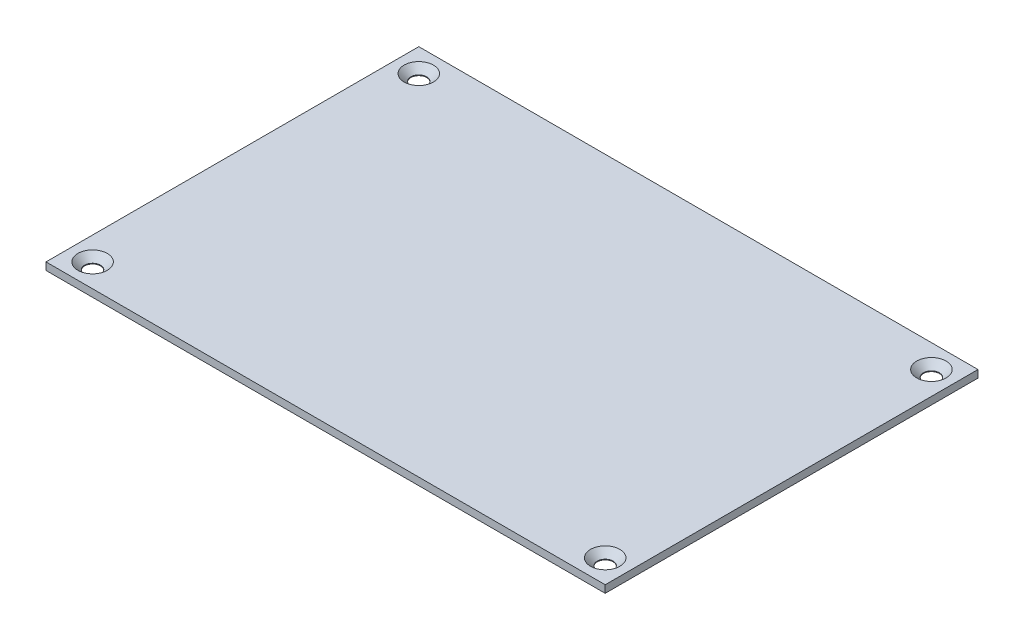
ISO-10303-21;
HEADER;
FILE_DESCRIPTION(('STEP AP214'),'2;1');
FILE_NAME('part.step','',(''),(''),'','','');
FILE_SCHEMA(('AUTOMOTIVE_DESIGN { 1 0 10303 214 1 1 1 1 }'));
ENDSEC;
DATA;
#1=APPLICATION_CONTEXT('core data for automotive mechanical design processes');
#2=APPLICATION_PROTOCOL_DEFINITION('international standard','automotive_design',2000,#1);
#3=PRODUCT_CONTEXT('',#1,'mechanical');
#4=PRODUCT('Part','Part','',(#3));
#5=PRODUCT_RELATED_PRODUCT_CATEGORY('part','',(#4));
#6=PRODUCT_DEFINITION_FORMATION('','',#4);
#7=PRODUCT_DEFINITION_CONTEXT('part definition',#1,'design');
#8=PRODUCT_DEFINITION('design','',#6,#7);
#9=PRODUCT_DEFINITION_SHAPE('','',#8);
#10=(LENGTH_UNIT() NAMED_UNIT(*) SI_UNIT(.MILLI.,.METRE.));
#11=(NAMED_UNIT(*) PLANE_ANGLE_UNIT() SI_UNIT($,.RADIAN.));
#12=(NAMED_UNIT(*) SI_UNIT($,.STERADIAN.) SOLID_ANGLE_UNIT());
#13=UNCERTAINTY_MEASURE_WITH_UNIT(LENGTH_MEASURE(1.E-05),#10,'distance_accuracy_value','');
#14=(GEOMETRIC_REPRESENTATION_CONTEXT(3) GLOBAL_UNCERTAINTY_ASSIGNED_CONTEXT((#13)) GLOBAL_UNIT_ASSIGNED_CONTEXT((#10,
#11,#12)) REPRESENTATION_CONTEXT('',''));
#15=CARTESIAN_POINT('',(0.,0.,0.));
#16=DIRECTION('',(0.,0.,1.));
#17=DIRECTION('',(1.,0.,0.));
#18=AXIS2_PLACEMENT_3D('',#15,#16,#17);
#19=CARTESIAN_POINT('',(0.,1.6,0.));
#20=DIRECTION('',(1.,0.,0.));
#21=DIRECTION('',(0.,0.,-1.));
#22=AXIS2_PLACEMENT_3D('',#19,#20,#21);
#23=PLANE('',#22);
#24=DIRECTION('',(0.,0.,1.));
#25=VECTOR('',#24,1.);
#26=CARTESIAN_POINT('',(0.,0.,0.));
#27=LINE('',#26,#25);
#28=CARTESIAN_POINT('',(0.,0.,-80.0000000000001));
#29=VERTEX_POINT('',#28);
#30=CARTESIAN_POINT('',(0.,0.,0.));
#31=VERTEX_POINT('',#30);
#32=EDGE_CURVE('E116',#29,#31,#27,.T.);
#33=ORIENTED_EDGE('',*,*,#32,.T.);
#34=DIRECTION('',(0.,-1.,0.));
#35=VECTOR('',#34,1.);
#36=CARTESIAN_POINT('',(0.,1.6,0.));
#37=LINE('',#36,#35);
#38=CARTESIAN_POINT('',(0.,1.6,0.));
#39=VERTEX_POINT('',#38);
#40=EDGE_CURVE('E11',#39,#31,#37,.T.);
#41=ORIENTED_EDGE('',*,*,#40,.F.);
#42=DIRECTION('',(0.,0.,1.));
#43=VECTOR('',#42,1.);
#44=CARTESIAN_POINT('',(0.,1.6,0.));
#45=LINE('',#44,#43);
#46=CARTESIAN_POINT('',(0.,1.6,-80.0000000000001));
#47=VERTEX_POINT('',#46);
#48=EDGE_CURVE('E99',#47,#39,#45,.T.);
#49=ORIENTED_EDGE('',*,*,#48,.F.);
#50=DIRECTION('',(0.,-1.,0.));
#51=VECTOR('',#50,1.);
#52=CARTESIAN_POINT('',(0.,1.6,-80.0000000000001));
#53=LINE('',#52,#51);
#54=EDGE_CURVE('E112',#47,#29,#53,.T.);
#55=ORIENTED_EDGE('',*,*,#54,.T.);
#56=EDGE_LOOP('',(#33,#41,#49,#55));
#57=FACE_BOUND('',#56,.T.);
#58=ADVANCED_FACE('F45',(#57),#23,.F.);
#59=CARTESIAN_POINT('',(0.,1.6,0.));
#60=DIRECTION('',(0.,0.,-1.));
#61=DIRECTION('',(-1.,0.,0.));
#62=AXIS2_PLACEMENT_3D('',#59,#60,#61);
#63=PLANE('',#62);
#64=DIRECTION('',(1.,0.,0.));
#65=VECTOR('',#64,1.);
#66=CARTESIAN_POINT('',(0.,0.,0.));
#67=LINE('',#66,#65);
#68=CARTESIAN_POINT('',(120.,0.,0.));
#69=VERTEX_POINT('',#68);
#70=EDGE_CURVE('E104',#31,#69,#67,.T.);
#71=ORIENTED_EDGE('',*,*,#70,.T.);
#72=DIRECTION('',(0.,-1.,0.));
#73=VECTOR('',#72,1.);
#74=CARTESIAN_POINT('',(120.,1.6,0.));
#75=LINE('',#74,#73);
#76=CARTESIAN_POINT('',(120.,1.6,0.));
#77=VERTEX_POINT('',#76);
#78=EDGE_CURVE('E55',#77,#69,#75,.T.);
#79=ORIENTED_EDGE('',*,*,#78,.F.);
#80=DIRECTION('',(1.,0.,0.));
#81=VECTOR('',#80,1.);
#82=CARTESIAN_POINT('',(0.,1.6,0.));
#83=LINE('',#82,#81);
#84=EDGE_CURVE('E94',#39,#77,#83,.T.);
#85=ORIENTED_EDGE('',*,*,#84,.F.);
#86=ORIENTED_EDGE('',*,*,#40,.T.);
#87=EDGE_LOOP('',(#71,#79,#85,#86));
#88=FACE_BOUND('',#87,.T.);
#89=ADVANCED_FACE('F103',(#88),#63,.F.);
#90=CARTESIAN_POINT('',(120.,1.6,0.));
#91=DIRECTION('',(-1.,0.,0.));
#92=DIRECTION('',(0.,0.,1.));
#93=AXIS2_PLACEMENT_3D('',#90,#91,#92);
#94=PLANE('',#93);
#95=DIRECTION('',(0.,0.,-1.));
#96=VECTOR('',#95,1.);
#97=CARTESIAN_POINT('',(120.,0.,0.));
#98=LINE('',#97,#96);
#99=CARTESIAN_POINT('',(120.,0.,-80.0000000000001));
#100=VERTEX_POINT('',#99);
#101=EDGE_CURVE('E81',#69,#100,#98,.T.);
#102=ORIENTED_EDGE('',*,*,#101,.T.);
#103=DIRECTION('',(0.,-1.,0.));
#104=VECTOR('',#103,1.);
#105=CARTESIAN_POINT('',(120.,1.6,-80.0000000000001));
#106=LINE('',#105,#104);
#107=CARTESIAN_POINT('',(120.,1.6,-80.0000000000001));
#108=VERTEX_POINT('',#107);
#109=EDGE_CURVE('E106',#108,#100,#106,.T.);
#110=ORIENTED_EDGE('',*,*,#109,.F.);
#111=DIRECTION('',(0.,0.,-1.));
#112=VECTOR('',#111,1.);
#113=CARTESIAN_POINT('',(120.,1.6,0.));
#114=LINE('',#113,#112);
#115=EDGE_CURVE('E97',#77,#108,#114,.T.);
#116=ORIENTED_EDGE('',*,*,#115,.F.);
#117=ORIENTED_EDGE('',*,*,#78,.T.);
#118=EDGE_LOOP('',(#102,#110,#116,#117));
#119=FACE_BOUND('',#118,.T.);
#120=ADVANCED_FACE('F108',(#119),#94,.F.);
#121=CARTESIAN_POINT('',(0.,1.6,-80.0000000000001));
#122=DIRECTION('',(0.,0.,1.));
#123=DIRECTION('',(1.,0.,0.));
#124=AXIS2_PLACEMENT_3D('',#121,#122,#123);
#125=PLANE('',#124);
#126=DIRECTION('',(-1.,0.,0.));
#127=VECTOR('',#126,1.);
#128=CARTESIAN_POINT('',(0.,0.,-80.0000000000001));
#129=LINE('',#128,#127);
#130=EDGE_CURVE('E87',#100,#29,#129,.T.);
#131=ORIENTED_EDGE('',*,*,#130,.T.);
#132=ORIENTED_EDGE('',*,*,#54,.F.);
#133=DIRECTION('',(-1.,0.,0.));
#134=VECTOR('',#133,1.);
#135=CARTESIAN_POINT('',(0.,1.6,-80.0000000000001));
#136=LINE('',#135,#134);
#137=EDGE_CURVE('E64',#108,#47,#136,.T.);
#138=ORIENTED_EDGE('',*,*,#137,.F.);
#139=ORIENTED_EDGE('',*,*,#109,.T.);
#140=EDGE_LOOP('',(#131,#132,#138,#139));
#141=FACE_BOUND('',#140,.T.);
#142=ADVANCED_FACE('F183',(#141),#125,.F.);
#143=CARTESIAN_POINT('',(0.,1.6,0.));
#144=DIRECTION('',(0.,-1.,0.));
#145=DIRECTION('',(0.,0.,-1.));
#146=AXIS2_PLACEMENT_3D('',#143,#144,#145);
#147=PLANE('',#146);
#148=CARTESIAN_POINT('',(5.,1.6,-75.0000000000001));
#149=DIRECTION('',(0.,1.,0.));
#150=DIRECTION('',(0.,0.,1.));
#151=AXIS2_PLACEMENT_3D('',#148,#149,#150);
#152=CIRCLE('',#151,3.15);
#153=CARTESIAN_POINT('',(5.,1.6,-71.8500000000001));
#154=VERTEX_POINT('',#153);
#155=EDGE_CURVE('E305',#154,#154,#152,.T.);
#156=ORIENTED_EDGE('',*,*,#155,.F.);
#157=EDGE_LOOP('',(#156));
#158=FACE_BOUND('',#157,.T.);
#159=CARTESIAN_POINT('',(5.,1.6,-5.));
#160=DIRECTION('',(0.,1.,0.));
#161=DIRECTION('',(0.,0.,1.));
#162=AXIS2_PLACEMENT_3D('',#159,#160,#161);
#163=CIRCLE('',#162,3.15);
#164=CARTESIAN_POINT('',(5.,1.6,-1.85));
#165=VERTEX_POINT('',#164);
#166=EDGE_CURVE('E152',#165,#165,#163,.T.);
#167=ORIENTED_EDGE('',*,*,#166,.F.);
#168=EDGE_LOOP('',(#167));
#169=FACE_BOUND('',#168,.T.);
#170=CARTESIAN_POINT('',(115.,1.6,-5.));
#171=DIRECTION('',(0.,1.,0.));
#172=DIRECTION('',(0.,0.,1.));
#173=AXIS2_PLACEMENT_3D('',#170,#171,#172);
#174=CIRCLE('',#173,3.15);
#175=CARTESIAN_POINT('',(115.,1.6,-1.85));
#176=VERTEX_POINT('',#175);
#177=EDGE_CURVE('E143',#176,#176,#174,.T.);
#178=ORIENTED_EDGE('',*,*,#177,.F.);
#179=EDGE_LOOP('',(#178));
#180=FACE_BOUND('',#179,.T.);
#181=CARTESIAN_POINT('',(115.,1.6,-75.0000000000001));
#182=DIRECTION('',(0.,1.,0.));
#183=DIRECTION('',(0.,0.,1.));
#184=AXIS2_PLACEMENT_3D('',#181,#182,#183);
#185=CIRCLE('',#184,3.15);
#186=CARTESIAN_POINT('',(115.,1.6,-71.8500000000001));
#187=VERTEX_POINT('',#186);
#188=EDGE_CURVE('E138',#187,#187,#185,.T.);
#189=ORIENTED_EDGE('',*,*,#188,.F.);
#190=EDGE_LOOP('',(#189));
#191=FACE_BOUND('',#190,.T.);
#192=ORIENTED_EDGE('',*,*,#48,.T.);
#193=ORIENTED_EDGE('',*,*,#84,.T.);
#194=ORIENTED_EDGE('',*,*,#115,.T.);
#195=ORIENTED_EDGE('',*,*,#137,.T.);
#196=EDGE_LOOP('',(#192,#193,#194,#195));
#197=FACE_BOUND('',#196,.T.);
#198=ADVANCED_FACE('F95',(#158,#169,#180,#191,#197),#147,.F.);
#199=CARTESIAN_POINT('',(0.,0.,0.));
#200=DIRECTION('',(0.,-1.,0.));
#201=DIRECTION('',(0.,0.,-1.));
#202=AXIS2_PLACEMENT_3D('',#199,#200,#201);
#203=PLANE('',#202);
#204=CARTESIAN_POINT('',(5.,0.,-75.0000000000001));
#205=DIRECTION('',(0.,-1.,0.));
#206=DIRECTION('',(0.,0.,-1.));
#207=AXIS2_PLACEMENT_3D('',#204,#205,#206);
#208=CIRCLE('',#207,1.69999999999999);
#209=CARTESIAN_POINT('',(5.,0.,-76.7000000000001));
#210=VERTEX_POINT('',#209);
#211=EDGE_CURVE('E48',#210,#210,#208,.T.);
#212=ORIENTED_EDGE('',*,*,#211,.F.);
#213=EDGE_LOOP('',(#212));
#214=FACE_BOUND('',#213,.T.);
#215=CARTESIAN_POINT('',(5.,0.,-5.));
#216=DIRECTION('',(0.,-1.,0.));
#217=DIRECTION('',(0.,0.,-1.));
#218=AXIS2_PLACEMENT_3D('',#215,#216,#217);
#219=CIRCLE('',#218,1.69999999999999);
#220=CARTESIAN_POINT('',(5.,0.,-6.69999999999999));
#221=VERTEX_POINT('',#220);
#222=EDGE_CURVE('E140',#221,#221,#219,.T.);
#223=ORIENTED_EDGE('',*,*,#222,.F.);
#224=EDGE_LOOP('',(#223));
#225=FACE_BOUND('',#224,.T.);
#226=CARTESIAN_POINT('',(115.,0.,-5.));
#227=DIRECTION('',(0.,-1.,0.));
#228=DIRECTION('',(0.,0.,-1.));
#229=AXIS2_PLACEMENT_3D('',#226,#227,#228);
#230=CIRCLE('',#229,1.69999999999999);
#231=CARTESIAN_POINT('',(115.,0.,-6.69999999999999));
#232=VERTEX_POINT('',#231);
#233=EDGE_CURVE('E135',#232,#232,#230,.T.);
#234=ORIENTED_EDGE('',*,*,#233,.F.);
#235=EDGE_LOOP('',(#234));
#236=FACE_BOUND('',#235,.T.);
#237=CARTESIAN_POINT('',(115.,0.,-75.0000000000001));
#238=DIRECTION('',(0.,-1.,0.));
#239=DIRECTION('',(0.,0.,-1.));
#240=AXIS2_PLACEMENT_3D('',#237,#238,#239);
#241=CIRCLE('',#240,1.69999999999999);
#242=CARTESIAN_POINT('',(115.,0.,-76.7));
#243=VERTEX_POINT('',#242);
#244=EDGE_CURVE('E120',#243,#243,#241,.T.);
#245=ORIENTED_EDGE('',*,*,#244,.F.);
#246=EDGE_LOOP('',(#245));
#247=FACE_BOUND('',#246,.T.);
#248=ORIENTED_EDGE('',*,*,#32,.F.);
#249=ORIENTED_EDGE('',*,*,#130,.F.);
#250=ORIENTED_EDGE('',*,*,#101,.F.);
#251=ORIENTED_EDGE('',*,*,#70,.F.);
#252=EDGE_LOOP('',(#248,#249,#250,#251));
#253=FACE_BOUND('',#252,.T.);
#254=ADVANCED_FACE('F182',(#214,#225,#236,#247,#253),#203,.T.);
#255=CARTESIAN_POINT('',(115.,1.6,-75.0000000000001));
#256=DIRECTION('',(0.,1.,0.));
#257=DIRECTION('',(0.,0.,1.));
#258=AXIS2_PLACEMENT_3D('',#255,#256,#257);
#259=CYLINDRICAL_SURFACE('',#258,1.69999999999999);
#260=ORIENTED_EDGE('',*,*,#244,.T.);
#261=EDGE_LOOP('',(#260));
#262=FACE_BOUND('',#261,.T.);
#263=CARTESIAN_POINT('',(115.,0.149999999999993,-75.0000000000001));
#264=DIRECTION('',(0.,1.,0.));
#265=DIRECTION('',(0.,0.,1.));
#266=AXIS2_PLACEMENT_3D('',#263,#264,#265);
#267=CIRCLE('',#266,1.69999999999999);
#268=CARTESIAN_POINT('',(115.,0.149999999999993,-73.3000000000001));
#269=VERTEX_POINT('',#268);
#270=EDGE_CURVE('E134',#269,#269,#267,.T.);
#271=ORIENTED_EDGE('',*,*,#270,.T.);
#272=EDGE_LOOP('',(#271));
#273=FACE_BOUND('',#272,.T.);
#274=ADVANCED_FACE('F172',(#262,#273),#259,.F.);
#275=CARTESIAN_POINT('',(115.,1.6,-75.0000000000001));
#276=DIRECTION('',(0.,1.,0.));
#277=DIRECTION('',(0.,0.,1.));
#278=AXIS2_PLACEMENT_3D('',#275,#276,#277);
#279=CONICAL_SURFACE('',#278,3.15,0.785398163397448);
#280=ORIENTED_EDGE('',*,*,#270,.F.);
#281=EDGE_LOOP('',(#280));
#282=FACE_BOUND('',#281,.T.);
#283=ORIENTED_EDGE('',*,*,#188,.T.);
#284=EDGE_LOOP('',(#283));
#285=FACE_BOUND('',#284,.T.);
#286=ADVANCED_FACE('F174',(#282,#285),#279,.F.);
#287=CARTESIAN_POINT('',(115.,1.6,-5.));
#288=DIRECTION('',(0.,1.,0.));
#289=DIRECTION('',(0.,0.,1.));
#290=AXIS2_PLACEMENT_3D('',#287,#288,#289);
#291=CYLINDRICAL_SURFACE('',#290,1.69999999999999);
#292=ORIENTED_EDGE('',*,*,#233,.T.);
#293=EDGE_LOOP('',(#292));
#294=FACE_BOUND('',#293,.T.);
#295=CARTESIAN_POINT('',(115.,0.149999999999993,-5.));
#296=DIRECTION('',(0.,1.,0.));
#297=DIRECTION('',(0.,0.,1.));
#298=AXIS2_PLACEMENT_3D('',#295,#296,#297);
#299=CIRCLE('',#298,1.69999999999999);
#300=CARTESIAN_POINT('',(115.,0.149999999999993,-3.30000000000001));
#301=VERTEX_POINT('',#300);
#302=EDGE_CURVE('E139',#301,#301,#299,.T.);
#303=ORIENTED_EDGE('',*,*,#302,.T.);
#304=EDGE_LOOP('',(#303));
#305=FACE_BOUND('',#304,.T.);
#306=ADVANCED_FACE('F177',(#294,#305),#291,.F.);
#307=CARTESIAN_POINT('',(115.,1.6,-5.));
#308=DIRECTION('',(0.,1.,0.));
#309=DIRECTION('',(0.,0.,1.));
#310=AXIS2_PLACEMENT_3D('',#307,#308,#309);
#311=CONICAL_SURFACE('',#310,3.15,0.785398163397448);
#312=ORIENTED_EDGE('',*,*,#302,.F.);
#313=EDGE_LOOP('',(#312));
#314=FACE_BOUND('',#313,.T.);
#315=ORIENTED_EDGE('',*,*,#177,.T.);
#316=EDGE_LOOP('',(#315));
#317=FACE_BOUND('',#316,.T.);
#318=ADVANCED_FACE('F248',(#314,#317),#311,.F.);
#319=CARTESIAN_POINT('',(5.,1.6,-5.));
#320=DIRECTION('',(0.,1.,0.));
#321=DIRECTION('',(0.,0.,1.));
#322=AXIS2_PLACEMENT_3D('',#319,#320,#321);
#323=CYLINDRICAL_SURFACE('',#322,1.69999999999999);
#324=ORIENTED_EDGE('',*,*,#222,.T.);
#325=EDGE_LOOP('',(#324));
#326=FACE_BOUND('',#325,.T.);
#327=CARTESIAN_POINT('',(5.,0.149999999999993,-5.));
#328=DIRECTION('',(0.,1.,0.));
#329=DIRECTION('',(0.,0.,1.));
#330=AXIS2_PLACEMENT_3D('',#327,#328,#329);
#331=CIRCLE('',#330,1.69999999999999);
#332=CARTESIAN_POINT('',(5.,0.149999999999993,-3.30000000000001));
#333=VERTEX_POINT('',#332);
#334=EDGE_CURVE('E144',#333,#333,#331,.T.);
#335=ORIENTED_EDGE('',*,*,#334,.T.);
#336=EDGE_LOOP('',(#335));
#337=FACE_BOUND('',#336,.T.);
#338=ADVANCED_FACE('F258',(#326,#337),#323,.F.);
#339=CARTESIAN_POINT('',(5.,1.6,-5.));
#340=DIRECTION('',(0.,1.,0.));
#341=DIRECTION('',(0.,0.,1.));
#342=AXIS2_PLACEMENT_3D('',#339,#340,#341);
#343=CONICAL_SURFACE('',#342,3.15,0.78539816339745);
#344=ORIENTED_EDGE('',*,*,#334,.F.);
#345=EDGE_LOOP('',(#344));
#346=FACE_BOUND('',#345,.T.);
#347=ORIENTED_EDGE('',*,*,#166,.T.);
#348=EDGE_LOOP('',(#347));
#349=FACE_BOUND('',#348,.T.);
#350=ADVANCED_FACE('F268',(#346,#349),#343,.F.);
#351=CARTESIAN_POINT('',(5.,1.6,-75.0000000000001));
#352=DIRECTION('',(0.,1.,0.));
#353=DIRECTION('',(0.,0.,1.));
#354=AXIS2_PLACEMENT_3D('',#351,#352,#353);
#355=CYLINDRICAL_SURFACE('',#354,1.69999999999999);
#356=ORIENTED_EDGE('',*,*,#211,.T.);
#357=EDGE_LOOP('',(#356));
#358=FACE_BOUND('',#357,.T.);
#359=CARTESIAN_POINT('',(5.,0.149999999999993,-75.0000000000001));
#360=DIRECTION('',(0.,1.,0.));
#361=DIRECTION('',(0.,0.,1.));
#362=AXIS2_PLACEMENT_3D('',#359,#360,#361);
#363=CIRCLE('',#362,1.69999999999999);
#364=CARTESIAN_POINT('',(5.,0.149999999999993,-73.3000000000001));
#365=VERTEX_POINT('',#364);
#366=EDGE_CURVE('E303',#365,#365,#363,.T.);
#367=ORIENTED_EDGE('',*,*,#366,.T.);
#368=EDGE_LOOP('',(#367));
#369=FACE_BOUND('',#368,.T.);
#370=ADVANCED_FACE('F277',(#358,#369),#355,.F.);
#371=CARTESIAN_POINT('',(5.,1.6,-75.0000000000001));
#372=DIRECTION('',(0.,1.,0.));
#373=DIRECTION('',(0.,0.,1.));
#374=AXIS2_PLACEMENT_3D('',#371,#372,#373);
#375=CONICAL_SURFACE('',#374,3.15,0.78539816339745);
#376=ORIENTED_EDGE('',*,*,#366,.F.);
#377=EDGE_LOOP('',(#376));
#378=FACE_BOUND('',#377,.T.);
#379=ORIENTED_EDGE('',*,*,#155,.T.);
#380=EDGE_LOOP('',(#379));
#381=FACE_BOUND('',#380,.T.);
#382=ADVANCED_FACE('F287',(#378,#381),#375,.F.);
#383=CLOSED_SHELL('',(#58,#89,#120,#142,#198,#254,#274,#286,#306,#318,#338,#350,#370,#382));
#384=MANIFOLD_SOLID_BREP('B2',#383);
#385=ADVANCED_BREP_SHAPE_REPRESENTATION('',(#18,#384),#14);
#386=SHAPE_DEFINITION_REPRESENTATION(#9,#385);
ENDSEC;
END-ISO-10303-21;
